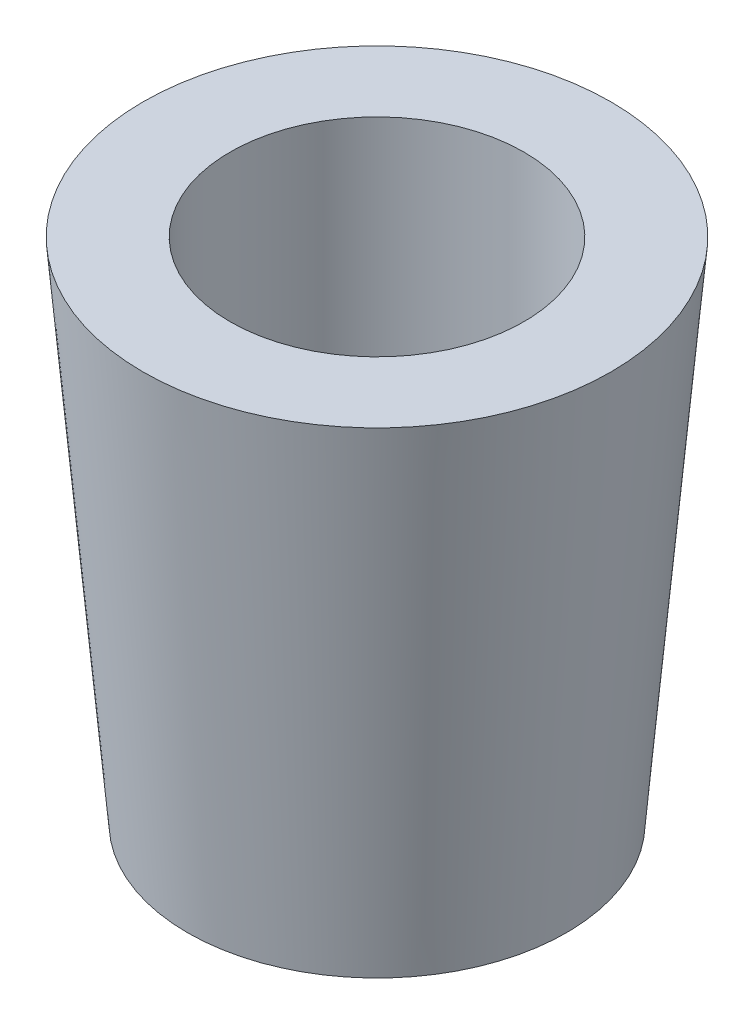
ISO-10303-21;
HEADER;
FILE_DESCRIPTION(('STEP AP214'),'2;1');
FILE_NAME('part.step','',(''),(''),'','','');
FILE_SCHEMA(('AUTOMOTIVE_DESIGN { 1 0 10303 214 1 1 1 1 }'));
ENDSEC;
DATA;
#1=APPLICATION_CONTEXT('core data for automotive mechanical design processes');
#2=APPLICATION_PROTOCOL_DEFINITION('international standard','automotive_design',2000,#1);
#3=PRODUCT_CONTEXT('',#1,'mechanical');
#4=PRODUCT('Part','Part','',(#3));
#5=PRODUCT_RELATED_PRODUCT_CATEGORY('part','',(#4));
#6=PRODUCT_DEFINITION_FORMATION('','',#4);
#7=PRODUCT_DEFINITION_CONTEXT('part definition',#1,'design');
#8=PRODUCT_DEFINITION('design','',#6,#7);
#9=PRODUCT_DEFINITION_SHAPE('','',#8);
#10=(LENGTH_UNIT() NAMED_UNIT(*) SI_UNIT(.MILLI.,.METRE.));
#11=(NAMED_UNIT(*) PLANE_ANGLE_UNIT() SI_UNIT($,.RADIAN.));
#12=(NAMED_UNIT(*) SI_UNIT($,.STERADIAN.) SOLID_ANGLE_UNIT());
#13=UNCERTAINTY_MEASURE_WITH_UNIT(LENGTH_MEASURE(1.E-05),#10,'distance_accuracy_value','');
#14=(GEOMETRIC_REPRESENTATION_CONTEXT(3) GLOBAL_UNCERTAINTY_ASSIGNED_CONTEXT((#13)) GLOBAL_UNIT_ASSIGNED_CONTEXT((#10,
#11,#12)) REPRESENTATION_CONTEXT('',''));
#15=CARTESIAN_POINT('',(0.,0.,0.));
#16=DIRECTION('',(0.,0.,1.));
#17=DIRECTION('',(1.,0.,0.));
#18=AXIS2_PLACEMENT_3D('',#15,#16,#17);
#19=CARTESIAN_POINT('',(0.,-25.4,0.));
#20=DIRECTION('',(0.,1.,0.));
#21=DIRECTION('',(0.,0.,1.));
#22=AXIS2_PLACEMENT_3D('',#19,#20,#21);
#23=CYLINDRICAL_SURFACE('',#22,3.175);
#24=CARTESIAN_POINT('',(0.,-25.4,0.));
#25=DIRECTION('',(0.,1.,0.));
#26=DIRECTION('',(0.,0.,1.));
#27=AXIS2_PLACEMENT_3D('',#24,#25,#26);
#28=CIRCLE('',#27,3.175);
#29=CARTESIAN_POINT('',(0.,-25.4,3.175));
#30=VERTEX_POINT('',#29);
#31=EDGE_CURVE('E43',#30,#30,#28,.T.);
#32=ORIENTED_EDGE('',*,*,#31,.F.);
#33=EDGE_LOOP('',(#32));
#34=FACE_BOUND('',#33,.T.);
#35=CARTESIAN_POINT('',(0.,-12.7,0.));
#36=DIRECTION('',(0.,1.,0.));
#37=DIRECTION('',(0.,0.,1.));
#38=AXIS2_PLACEMENT_3D('',#35,#36,#37);
#39=CIRCLE('',#38,3.175);
#40=CARTESIAN_POINT('',(0.,-12.7,3.175));
#41=VERTEX_POINT('',#40);
#42=EDGE_CURVE('E35',#41,#41,#39,.F.);
#43=ORIENTED_EDGE('',*,*,#42,.F.);
#44=EDGE_LOOP('',(#43));
#45=FACE_BOUND('',#44,.T.);
#46=ADVANCED_FACE('F31',(#34,#45),#23,.F.);
#47=CARTESIAN_POINT('',(0.,0.,0.));
#48=DIRECTION('',(0.,1.,0.));
#49=DIRECTION('',(0.,0.,1.));
#50=AXIS2_PLACEMENT_3D('',#47,#48,#49);
#51=CONICAL_SURFACE('',#50,11.7,0.0872664625997167);
#52=CARTESIAN_POINT('',(0.,-25.4,0.));
#53=DIRECTION('',(0.,1.,0.));
#54=DIRECTION('',(0.,0.,1.));
#55=AXIS2_PLACEMENT_3D('',#52,#53,#54);
#56=CIRCLE('',#55,9.47778794644153);
#57=CARTESIAN_POINT('',(0.,-25.4,9.47778794644153));
#58=VERTEX_POINT('',#57);
#59=EDGE_CURVE('E10',#58,#58,#56,.T.);
#60=ORIENTED_EDGE('',*,*,#59,.T.);
#61=EDGE_LOOP('',(#60));
#62=FACE_BOUND('',#61,.T.);
#63=CARTESIAN_POINT('',(0.,0.,0.));
#64=DIRECTION('',(0.,1.,0.));
#65=DIRECTION('',(0.,0.,1.));
#66=AXIS2_PLACEMENT_3D('',#63,#64,#65);
#67=CIRCLE('',#66,11.7);
#68=CARTESIAN_POINT('',(0.,0.,11.7));
#69=VERTEX_POINT('',#68);
#70=EDGE_CURVE('E39',#69,#69,#67,.T.);
#71=ORIENTED_EDGE('',*,*,#70,.F.);
#72=EDGE_LOOP('',(#71));
#73=FACE_BOUND('',#72,.T.);
#74=ADVANCED_FACE('F33',(#62,#73),#51,.T.);
#75=CARTESIAN_POINT('',(0.,-25.4,0.));
#76=DIRECTION('',(0.,1.,0.));
#77=DIRECTION('',(0.,0.,1.));
#78=AXIS2_PLACEMENT_3D('',#75,#76,#77);
#79=PLANE('',#78);
#80=CARTESIAN_POINT('',(5.82639397322076,-25.4,0.));
#81=DIRECTION('',(0.,-1.,0.));
#82=DIRECTION('',(0.,0.,-1.));
#83=AXIS2_PLACEMENT_3D('',#80,#81,#82);
#84=CIRCLE('',#83,1.75);
#85=CARTESIAN_POINT('',(5.82639397322076,-25.4,-1.75000000000004));
#86=VERTEX_POINT('',#85);
#87=EDGE_CURVE('E70',#86,#86,#84,.T.);
#88=ORIENTED_EDGE('',*,*,#87,.F.);
#89=EDGE_LOOP('',(#88));
#90=FACE_BOUND('',#89,.T.);
#91=CARTESIAN_POINT('',(0.,-25.4,-5.82639397322076));
#92=DIRECTION('',(0.,-1.,0.));
#93=DIRECTION('',(0.,0.,-1.));
#94=AXIS2_PLACEMENT_3D('',#91,#92,#93);
#95=CIRCLE('',#94,1.75);
#96=CARTESIAN_POINT('',(0.,-25.4,-7.57639397322076));
#97=VERTEX_POINT('',#96);
#98=EDGE_CURVE('E64',#97,#97,#95,.T.);
#99=ORIENTED_EDGE('',*,*,#98,.F.);
#100=EDGE_LOOP('',(#99));
#101=FACE_BOUND('',#100,.T.);
#102=CARTESIAN_POINT('',(-5.82639397322076,-25.4,0.));
#103=DIRECTION('',(0.,-1.,0.));
#104=DIRECTION('',(0.,0.,-1.));
#105=AXIS2_PLACEMENT_3D('',#102,#103,#104);
#106=CIRCLE('',#105,1.75);
#107=CARTESIAN_POINT('',(-5.82639397322076,-25.4,-1.75));
#108=VERTEX_POINT('',#107);
#109=EDGE_CURVE('E58',#108,#108,#106,.T.);
#110=ORIENTED_EDGE('',*,*,#109,.F.);
#111=EDGE_LOOP('',(#110));
#112=FACE_BOUND('',#111,.T.);
#113=CARTESIAN_POINT('',(0.,-25.4,5.82639397322076));
#114=DIRECTION('',(0.,-1.,0.));
#115=DIRECTION('',(0.,0.,-1.));
#116=AXIS2_PLACEMENT_3D('',#113,#114,#115);
#117=CIRCLE('',#116,1.75);
#118=CARTESIAN_POINT('',(0.,-25.4,4.07639397322076));
#119=VERTEX_POINT('',#118);
#120=EDGE_CURVE('E55',#119,#119,#117,.T.);
#121=ORIENTED_EDGE('',*,*,#120,.F.);
#122=EDGE_LOOP('',(#121));
#123=FACE_BOUND('',#122,.T.);
#124=ORIENTED_EDGE('',*,*,#31,.T.);
#125=EDGE_LOOP('',(#124));
#126=FACE_BOUND('',#125,.T.);
#127=ORIENTED_EDGE('',*,*,#59,.F.);
#128=EDGE_LOOP('',(#127));
#129=FACE_BOUND('',#128,.T.);
#130=ADVANCED_FACE('F81',(#90,#101,#112,#123,#126,#129),#79,.F.);
#131=CARTESIAN_POINT('',(0.,0.,0.));
#132=DIRECTION('',(0.,1.,0.));
#133=DIRECTION('',(0.,0.,1.));
#134=AXIS2_PLACEMENT_3D('',#131,#132,#133);
#135=PLANE('',#134);
#136=CARTESIAN_POINT('',(0.,0.,0.));
#137=DIRECTION('',(0.,1.,0.));
#138=DIRECTION('',(0.,0.,1.));
#139=AXIS2_PLACEMENT_3D('',#136,#137,#138);
#140=CIRCLE('',#139,7.35);
#141=CARTESIAN_POINT('',(0.,0.,7.35));
#142=VERTEX_POINT('',#141);
#143=EDGE_CURVE('E48',#142,#142,#140,.T.);
#144=ORIENTED_EDGE('',*,*,#143,.F.);
#145=EDGE_LOOP('',(#144));
#146=FACE_BOUND('',#145,.T.);
#147=ORIENTED_EDGE('',*,*,#70,.T.);
#148=EDGE_LOOP('',(#147));
#149=FACE_BOUND('',#148,.T.);
#150=ADVANCED_FACE('F84',(#146,#149),#135,.T.);
#151=CARTESIAN_POINT('',(0.,-12.7,0.));
#152=DIRECTION('',(0.,1.,0.));
#153=DIRECTION('',(0.,0.,1.));
#154=AXIS2_PLACEMENT_3D('',#151,#152,#153);
#155=PLANE('',#154);
#156=CARTESIAN_POINT('',(0.,-12.7,0.));
#157=DIRECTION('',(0.,1.,0.));
#158=DIRECTION('',(0.,0.,1.));
#159=AXIS2_PLACEMENT_3D('',#156,#157,#158);
#160=CIRCLE('',#159,7.35);
#161=CARTESIAN_POINT('',(0.,-12.7,7.35));
#162=VERTEX_POINT('',#161);
#163=EDGE_CURVE('E51',#162,#162,#160,.T.);
#164=ORIENTED_EDGE('',*,*,#163,.T.);
#165=EDGE_LOOP('',(#164));
#166=FACE_BOUND('',#165,.T.);
#167=ORIENTED_EDGE('',*,*,#42,.T.);
#168=EDGE_LOOP('',(#167));
#169=FACE_BOUND('',#168,.T.);
#170=ADVANCED_FACE('F101',(#166,#169),#155,.T.);
#171=CARTESIAN_POINT('',(0.,-12.7,0.));
#172=DIRECTION('',(0.,1.,0.));
#173=DIRECTION('',(0.,0.,1.));
#174=AXIS2_PLACEMENT_3D('',#171,#172,#173);
#175=CYLINDRICAL_SURFACE('',#174,7.35);
#176=ORIENTED_EDGE('',*,*,#163,.F.);
#177=EDGE_LOOP('',(#176));
#178=FACE_BOUND('',#177,.T.);
#179=ORIENTED_EDGE('',*,*,#143,.T.);
#180=EDGE_LOOP('',(#179));
#181=FACE_BOUND('',#180,.T.);
#182=ADVANCED_FACE('F103',(#178,#181),#175,.F.);
#183=CARTESIAN_POINT('',(0.,-17.78,5.82639397322076));
#184=DIRECTION('',(0.,-1.,0.));
#185=DIRECTION('',(0.,0.,-1.));
#186=AXIS2_PLACEMENT_3D('',#183,#184,#185);
#187=CYLINDRICAL_SURFACE('',#186,1.75);
#188=CARTESIAN_POINT('',(0.,-17.78,5.82639397322076));
#189=DIRECTION('',(0.,-1.,0.));
#190=DIRECTION('',(0.,0.,-1.));
#191=AXIS2_PLACEMENT_3D('',#188,#189,#190);
#192=CIRCLE('',#191,1.75);
#193=CARTESIAN_POINT('',(0.,-17.78,4.07639397322076));
#194=VERTEX_POINT('',#193);
#195=EDGE_CURVE('E52',#194,#194,#192,.T.);
#196=CARTESIAN_POINT('',(0.,-17.78,4.07639397322076));
#197=CARTESIAN_POINT('',(0.,-17.859375,4.07639397322076));
#198=CARTESIAN_POINT('',(0.,-17.93875,4.07639397322076));
#199=CARTESIAN_POINT('',(0.,-18.0975,4.07639397322076));
#200=CARTESIAN_POINT('',(0.,-18.176875,4.07639397322076));
#201=CARTESIAN_POINT('',(0.,-18.335625,4.07639397322076));
#202=CARTESIAN_POINT('',(0.,-18.415,4.07639397322076));
#203=CARTESIAN_POINT('',(0.,-18.57375,4.07639397322076));
#204=CARTESIAN_POINT('',(0.,-18.653125,4.07639397322076));
#205=CARTESIAN_POINT('',(0.,-18.811875,4.07639397322076));
#206=CARTESIAN_POINT('',(0.,-18.89125,4.07639397322076));
#207=CARTESIAN_POINT('',(0.,-19.05,4.07639397322076));
#208=CARTESIAN_POINT('',(0.,-19.129375,4.07639397322076));
#209=CARTESIAN_POINT('',(0.,-19.288125,4.07639397322076));
#210=CARTESIAN_POINT('',(0.,-19.3675,4.07639397322076));
#211=CARTESIAN_POINT('',(0.,-19.52625,4.07639397322076));
#212=CARTESIAN_POINT('',(0.,-19.605625,4.07639397322076));
#213=CARTESIAN_POINT('',(0.,-19.764375,4.07639397322076));
#214=CARTESIAN_POINT('',(0.,-19.84375,4.07639397322076));
#215=CARTESIAN_POINT('',(0.,-20.0025,4.07639397322076));
#216=CARTESIAN_POINT('',(0.,-20.081875,4.07639397322076));
#217=CARTESIAN_POINT('',(0.,-20.240625,4.07639397322076));
#218=CARTESIAN_POINT('',(0.,-20.32,4.07639397322076));
#219=CARTESIAN_POINT('',(0.,-20.47875,4.07639397322076));
#220=CARTESIAN_POINT('',(0.,-20.558125,4.07639397322076));
#221=CARTESIAN_POINT('',(0.,-20.716875,4.07639397322076));
#222=CARTESIAN_POINT('',(0.,-20.79625,4.07639397322076));
#223=CARTESIAN_POINT('',(0.,-20.955,4.07639397322076));
#224=CARTESIAN_POINT('',(0.,-21.034375,4.07639397322076));
#225=CARTESIAN_POINT('',(0.,-21.193125,4.07639397322076));
#226=CARTESIAN_POINT('',(0.,-21.2725,4.07639397322076));
#227=CARTESIAN_POINT('',(0.,-21.43125,4.07639397322076));
#228=CARTESIAN_POINT('',(0.,-21.510625,4.07639397322076));
#229=CARTESIAN_POINT('',(0.,-21.669375,4.07639397322076));
#230=CARTESIAN_POINT('',(0.,-21.74875,4.07639397322076));
#231=CARTESIAN_POINT('',(0.,-21.9075,4.07639397322076));
#232=CARTESIAN_POINT('',(0.,-21.986875,4.07639397322076));
#233=CARTESIAN_POINT('',(0.,-22.145625,4.07639397322076));
#234=CARTESIAN_POINT('',(0.,-22.225,4.07639397322076));
#235=CARTESIAN_POINT('',(0.,-22.38375,4.07639397322076));
#236=CARTESIAN_POINT('',(0.,-22.463125,4.07639397322076));
#237=CARTESIAN_POINT('',(0.,-22.621875,4.07639397322076));
#238=CARTESIAN_POINT('',(0.,-22.70125,4.07639397322076));
#239=CARTESIAN_POINT('',(0.,-22.86,4.07639397322076));
#240=CARTESIAN_POINT('',(0.,-22.939375,4.07639397322076));
#241=CARTESIAN_POINT('',(0.,-23.098125,4.07639397322076));
#242=CARTESIAN_POINT('',(0.,-23.1775,4.07639397322076));
#243=CARTESIAN_POINT('',(0.,-23.33625,4.07639397322076));
#244=CARTESIAN_POINT('',(0.,-23.415625,4.07639397322076));
#245=CARTESIAN_POINT('',(0.,-23.574375,4.07639397322076));
#246=CARTESIAN_POINT('',(0.,-23.65375,4.07639397322076));
#247=CARTESIAN_POINT('',(0.,-23.8125,4.07639397322076));
#248=CARTESIAN_POINT('',(0.,-23.891875,4.07639397322076));
#249=CARTESIAN_POINT('',(0.,-24.050625,4.07639397322076));
#250=CARTESIAN_POINT('',(0.,-24.13,4.07639397322076));
#251=CARTESIAN_POINT('',(0.,-24.28875,4.07639397322076));
#252=CARTESIAN_POINT('',(0.,-24.368125,4.07639397322076));
#253=CARTESIAN_POINT('',(0.,-24.526875,4.07639397322076));
#254=CARTESIAN_POINT('',(0.,-24.60625,4.07639397322076));
#255=CARTESIAN_POINT('',(0.,-24.765,4.07639397322076));
#256=CARTESIAN_POINT('',(0.,-24.844375,4.07639397322076));
#257=CARTESIAN_POINT('',(0.,-25.003125,4.07639397322076));
#258=CARTESIAN_POINT('',(0.,-25.0825,4.07639397322076));
#259=CARTESIAN_POINT('',(0.,-25.24125,4.07639397322076));
#260=CARTESIAN_POINT('',(0.,-25.320625,4.07639397322076));
#261=CARTESIAN_POINT('',(0.,-25.4,4.07639397322076));
#262=B_SPLINE_CURVE_WITH_KNOTS('',3,(#196,#197,#198,#199,#200,#201,#202,#203,#204,#205,#206,
#207,#208,#209,#210,#211,#212,#213,#214,#215,#216,#217,#218,#219,#220,#221,#222,#223,#224,#225,
#226,#227,#228,#229,#230,#231,#232,#233,#234,#235,#236,#237,#238,#239,#240,#241,#242,#243,#244,
#245,#246,#247,#248,#249,#250,#251,#252,#253,#254,#255,#256,#257,#258,#259,#260,#261),
.UNSPECIFIED.,.F.,.F.,(4,2,2,2,2,2,2,2,2,2,2,2,2,2,2,2,2,2,2,2,2,2,2,2,2,2,2,2,2,2,2,2,4),(0.,
0.238124999999999,0.476249999999998,0.714375,0.952499999999998,1.190625,1.42875,1.666875,1.905,
2.143125,2.38125,2.619375,2.8575,3.095625,3.33375,3.571875,3.81,4.048125,4.28624999999999,
4.524375,4.7625,5.000625,5.23875,5.476875,5.71499999999999,5.953125,6.19125,6.429375,6.6675,
6.905625,7.14374999999999,7.381875,7.61999999999999),.UNSPECIFIED.);
#263=EDGE_CURVE('BSEAM110',#194,#119,#262,.T.);
#264=ORIENTED_EDGE('',*,*,#195,.F.);
#265=ORIENTED_EDGE('',*,*,#120,.T.);
#266=ORIENTED_EDGE('',*,*,#263,.T.);
#267=ORIENTED_EDGE('',*,*,#263,.F.);
#268=EDGE_LOOP('',(#264,#266,#265,#267));
#269=FACE_BOUND('',#268,.T.);
#270=ADVANCED_FACE('F110',(#269),#187,.F.);
#271=CARTESIAN_POINT('',(0.,-17.78,5.82639397322076));
#272=DIRECTION('',(0.,-1.,0.));
#273=DIRECTION('',(0.,0.,-1.));
#274=AXIS2_PLACEMENT_3D('',#271,#272,#273);
#275=PLANE('',#274);
#276=ORIENTED_EDGE('',*,*,#195,.T.);
#277=EDGE_LOOP('',(#276));
#278=FACE_BOUND('',#277,.T.);
#279=ADVANCED_FACE('F117',(#278),#275,.T.);
#280=CARTESIAN_POINT('',(-5.82639397322076,-17.78,0.));
#281=DIRECTION('',(0.,-1.,0.));
#282=DIRECTION('',(0.,0.,-1.));
#283=AXIS2_PLACEMENT_3D('',#280,#281,#282);
#284=CYLINDRICAL_SURFACE('',#283,1.75);
#285=CARTESIAN_POINT('',(-5.82639397322076,-17.78,0.));
#286=DIRECTION('',(0.,-1.,0.));
#287=DIRECTION('',(0.,0.,-1.));
#288=AXIS2_PLACEMENT_3D('',#285,#286,#287);
#289=CIRCLE('',#288,1.75);
#290=CARTESIAN_POINT('',(-5.82639397322076,-17.78,-1.75));
#291=VERTEX_POINT('',#290);
#292=EDGE_CURVE('E61',#291,#291,#289,.T.);
#293=CARTESIAN_POINT('',(-5.82639397322076,-17.78,-1.75));
#294=CARTESIAN_POINT('',(-5.82639397322076,-17.859375,-1.75));
#295=CARTESIAN_POINT('',(-5.82639397322076,-17.93875,-1.75));
#296=CARTESIAN_POINT('',(-5.82639397322076,-18.0975,-1.75));
#297=CARTESIAN_POINT('',(-5.82639397322076,-18.176875,-1.75));
#298=CARTESIAN_POINT('',(-5.82639397322076,-18.335625,-1.75));
#299=CARTESIAN_POINT('',(-5.82639397322076,-18.415,-1.75));
#300=CARTESIAN_POINT('',(-5.82639397322076,-18.57375,-1.75));
#301=CARTESIAN_POINT('',(-5.82639397322076,-18.653125,-1.75));
#302=CARTESIAN_POINT('',(-5.82639397322076,-18.811875,-1.75));
#303=CARTESIAN_POINT('',(-5.82639397322076,-18.89125,-1.75));
#304=CARTESIAN_POINT('',(-5.82639397322076,-19.05,-1.75));
#305=CARTESIAN_POINT('',(-5.82639397322076,-19.129375,-1.75));
#306=CARTESIAN_POINT('',(-5.82639397322076,-19.288125,-1.75));
#307=CARTESIAN_POINT('',(-5.82639397322076,-19.3675,-1.75));
#308=CARTESIAN_POINT('',(-5.82639397322076,-19.52625,-1.75));
#309=CARTESIAN_POINT('',(-5.82639397322076,-19.605625,-1.75));
#310=CARTESIAN_POINT('',(-5.82639397322076,-19.764375,-1.75));
#311=CARTESIAN_POINT('',(-5.82639397322076,-19.84375,-1.75));
#312=CARTESIAN_POINT('',(-5.82639397322076,-20.0025,-1.75));
#313=CARTESIAN_POINT('',(-5.82639397322076,-20.081875,-1.75));
#314=CARTESIAN_POINT('',(-5.82639397322076,-20.240625,-1.75));
#315=CARTESIAN_POINT('',(-5.82639397322076,-20.32,-1.75));
#316=CARTESIAN_POINT('',(-5.82639397322076,-20.47875,-1.75));
#317=CARTESIAN_POINT('',(-5.82639397322076,-20.558125,-1.75));
#318=CARTESIAN_POINT('',(-5.82639397322076,-20.716875,-1.75));
#319=CARTESIAN_POINT('',(-5.82639397322076,-20.79625,-1.75));
#320=CARTESIAN_POINT('',(-5.82639397322076,-20.955,-1.75));
#321=CARTESIAN_POINT('',(-5.82639397322076,-21.034375,-1.75));
#322=CARTESIAN_POINT('',(-5.82639397322076,-21.193125,-1.75));
#323=CARTESIAN_POINT('',(-5.82639397322076,-21.2725,-1.75));
#324=CARTESIAN_POINT('',(-5.82639397322076,-21.43125,-1.75));
#325=CARTESIAN_POINT('',(-5.82639397322076,-21.510625,-1.75));
#326=CARTESIAN_POINT('',(-5.82639397322076,-21.669375,-1.75));
#327=CARTESIAN_POINT('',(-5.82639397322076,-21.74875,-1.75));
#328=CARTESIAN_POINT('',(-5.82639397322076,-21.9075,-1.75));
#329=CARTESIAN_POINT('',(-5.82639397322076,-21.986875,-1.75));
#330=CARTESIAN_POINT('',(-5.82639397322076,-22.145625,-1.75));
#331=CARTESIAN_POINT('',(-5.82639397322076,-22.225,-1.75));
#332=CARTESIAN_POINT('',(-5.82639397322076,-22.38375,-1.75));
#333=CARTESIAN_POINT('',(-5.82639397322076,-22.463125,-1.75));
#334=CARTESIAN_POINT('',(-5.82639397322076,-22.621875,-1.75));
#335=CARTESIAN_POINT('',(-5.82639397322076,-22.70125,-1.75));
#336=CARTESIAN_POINT('',(-5.82639397322076,-22.86,-1.75));
#337=CARTESIAN_POINT('',(-5.82639397322076,-22.939375,-1.75));
#338=CARTESIAN_POINT('',(-5.82639397322076,-23.098125,-1.75));
#339=CARTESIAN_POINT('',(-5.82639397322076,-23.1775,-1.75));
#340=CARTESIAN_POINT('',(-5.82639397322076,-23.33625,-1.75));
#341=CARTESIAN_POINT('',(-5.82639397322076,-23.415625,-1.75));
#342=CARTESIAN_POINT('',(-5.82639397322076,-23.574375,-1.75));
#343=CARTESIAN_POINT('',(-5.82639397322076,-23.65375,-1.75));
#344=CARTESIAN_POINT('',(-5.82639397322076,-23.8125,-1.75));
#345=CARTESIAN_POINT('',(-5.82639397322076,-23.891875,-1.75));
#346=CARTESIAN_POINT('',(-5.82639397322076,-24.050625,-1.75));
#347=CARTESIAN_POINT('',(-5.82639397322076,-24.13,-1.75));
#348=CARTESIAN_POINT('',(-5.82639397322076,-24.28875,-1.75));
#349=CARTESIAN_POINT('',(-5.82639397322076,-24.368125,-1.75));
#350=CARTESIAN_POINT('',(-5.82639397322076,-24.526875,-1.75));
#351=CARTESIAN_POINT('',(-5.82639397322076,-24.60625,-1.75));
#352=CARTESIAN_POINT('',(-5.82639397322076,-24.765,-1.75));
#353=CARTESIAN_POINT('',(-5.82639397322076,-24.844375,-1.75));
#354=CARTESIAN_POINT('',(-5.82639397322076,-25.003125,-1.75));
#355=CARTESIAN_POINT('',(-5.82639397322076,-25.0825,-1.75));
#356=CARTESIAN_POINT('',(-5.82639397322076,-25.24125,-1.75));
#357=CARTESIAN_POINT('',(-5.82639397322076,-25.320625,-1.75));
#358=CARTESIAN_POINT('',(-5.82639397322076,-25.4,-1.75));
#359=B_SPLINE_CURVE_WITH_KNOTS('',3,(#293,#294,#295,#296,#297,#298,#299,#300,#301,#302,#303,
#304,#305,#306,#307,#308,#309,#310,#311,#312,#313,#314,#315,#316,#317,#318,#319,#320,#321,#322,
#323,#324,#325,#326,#327,#328,#329,#330,#331,#332,#333,#334,#335,#336,#337,#338,#339,#340,#341,
#342,#343,#344,#345,#346,#347,#348,#349,#350,#351,#352,#353,#354,#355,#356,#357,#358),
.UNSPECIFIED.,.F.,.F.,(4,2,2,2,2,2,2,2,2,2,2,2,2,2,2,2,2,2,2,2,2,2,2,2,2,2,2,2,2,2,2,2,4),(0.,
0.238124999999999,0.476249999999998,0.714375,0.952499999999998,1.190625,1.42875,1.666875,1.905,
2.143125,2.38125,2.619375,2.8575,3.095625,3.33375,3.571875,3.81,4.048125,4.28624999999999,
4.524375,4.7625,5.000625,5.23875,5.476875,5.71499999999999,5.953125,6.19125,6.429375,6.6675,
6.905625,7.14374999999999,7.381875,7.61999999999999),.UNSPECIFIED.);
#360=EDGE_CURVE('BSEAM121',#291,#108,#359,.T.);
#361=ORIENTED_EDGE('',*,*,#292,.F.);
#362=ORIENTED_EDGE('',*,*,#109,.T.);
#363=ORIENTED_EDGE('',*,*,#360,.T.);
#364=ORIENTED_EDGE('',*,*,#360,.F.);
#365=EDGE_LOOP('',(#361,#363,#362,#364));
#366=FACE_BOUND('',#365,.T.);
#367=ADVANCED_FACE('F121',(#366),#284,.F.);
#368=CARTESIAN_POINT('',(-5.82639397322076,-17.78,0.));
#369=DIRECTION('',(0.,-1.,0.));
#370=DIRECTION('',(0.,0.,-1.));
#371=AXIS2_PLACEMENT_3D('',#368,#369,#370);
#372=PLANE('',#371);
#373=ORIENTED_EDGE('',*,*,#292,.T.);
#374=EDGE_LOOP('',(#373));
#375=FACE_BOUND('',#374,.T.);
#376=ADVANCED_FACE('F123',(#375),#372,.T.);
#377=CARTESIAN_POINT('',(0.,-17.78,-5.82639397322076));
#378=DIRECTION('',(0.,-1.,0.));
#379=DIRECTION('',(0.,0.,-1.));
#380=AXIS2_PLACEMENT_3D('',#377,#378,#379);
#381=CYLINDRICAL_SURFACE('',#380,1.75);
#382=CARTESIAN_POINT('',(0.,-17.78,-5.82639397322076));
#383=DIRECTION('',(0.,-1.,0.));
#384=DIRECTION('',(0.,0.,-1.));
#385=AXIS2_PLACEMENT_3D('',#382,#383,#384);
#386=CIRCLE('',#385,1.75);
#387=CARTESIAN_POINT('',(0.,-17.78,-7.57639397322076));
#388=VERTEX_POINT('',#387);
#389=EDGE_CURVE('E67',#388,#388,#386,.T.);
#390=CARTESIAN_POINT('',(0.,-17.78,-7.57639397322076));
#391=CARTESIAN_POINT('',(0.,-17.859375,-7.57639397322076));
#392=CARTESIAN_POINT('',(0.,-17.93875,-7.57639397322076));
#393=CARTESIAN_POINT('',(0.,-18.0975,-7.57639397322076));
#394=CARTESIAN_POINT('',(0.,-18.176875,-7.57639397322076));
#395=CARTESIAN_POINT('',(0.,-18.335625,-7.57639397322076));
#396=CARTESIAN_POINT('',(0.,-18.415,-7.57639397322076));
#397=CARTESIAN_POINT('',(0.,-18.57375,-7.57639397322076));
#398=CARTESIAN_POINT('',(0.,-18.653125,-7.57639397322076));
#399=CARTESIAN_POINT('',(0.,-18.811875,-7.57639397322076));
#400=CARTESIAN_POINT('',(0.,-18.89125,-7.57639397322076));
#401=CARTESIAN_POINT('',(0.,-19.05,-7.57639397322076));
#402=CARTESIAN_POINT('',(0.,-19.129375,-7.57639397322076));
#403=CARTESIAN_POINT('',(0.,-19.288125,-7.57639397322076));
#404=CARTESIAN_POINT('',(0.,-19.3675,-7.57639397322076));
#405=CARTESIAN_POINT('',(0.,-19.52625,-7.57639397322076));
#406=CARTESIAN_POINT('',(0.,-19.605625,-7.57639397322076));
#407=CARTESIAN_POINT('',(0.,-19.764375,-7.57639397322076));
#408=CARTESIAN_POINT('',(0.,-19.84375,-7.57639397322076));
#409=CARTESIAN_POINT('',(0.,-20.0025,-7.57639397322076));
#410=CARTESIAN_POINT('',(0.,-20.081875,-7.57639397322076));
#411=CARTESIAN_POINT('',(0.,-20.240625,-7.57639397322076));
#412=CARTESIAN_POINT('',(0.,-20.32,-7.57639397322076));
#413=CARTESIAN_POINT('',(0.,-20.47875,-7.57639397322076));
#414=CARTESIAN_POINT('',(0.,-20.558125,-7.57639397322076));
#415=CARTESIAN_POINT('',(0.,-20.716875,-7.57639397322076));
#416=CARTESIAN_POINT('',(0.,-20.79625,-7.57639397322076));
#417=CARTESIAN_POINT('',(0.,-20.955,-7.57639397322076));
#418=CARTESIAN_POINT('',(0.,-21.034375,-7.57639397322076));
#419=CARTESIAN_POINT('',(0.,-21.193125,-7.57639397322076));
#420=CARTESIAN_POINT('',(0.,-21.2725,-7.57639397322076));
#421=CARTESIAN_POINT('',(0.,-21.43125,-7.57639397322076));
#422=CARTESIAN_POINT('',(0.,-21.510625,-7.57639397322076));
#423=CARTESIAN_POINT('',(0.,-21.669375,-7.57639397322076));
#424=CARTESIAN_POINT('',(0.,-21.74875,-7.57639397322076));
#425=CARTESIAN_POINT('',(0.,-21.9075,-7.57639397322076));
#426=CARTESIAN_POINT('',(0.,-21.986875,-7.57639397322076));
#427=CARTESIAN_POINT('',(0.,-22.145625,-7.57639397322076));
#428=CARTESIAN_POINT('',(0.,-22.225,-7.57639397322076));
#429=CARTESIAN_POINT('',(0.,-22.38375,-7.57639397322076));
#430=CARTESIAN_POINT('',(0.,-22.463125,-7.57639397322076));
#431=CARTESIAN_POINT('',(0.,-22.621875,-7.57639397322076));
#432=CARTESIAN_POINT('',(0.,-22.70125,-7.57639397322076));
#433=CARTESIAN_POINT('',(0.,-22.86,-7.57639397322076));
#434=CARTESIAN_POINT('',(0.,-22.939375,-7.57639397322076));
#435=CARTESIAN_POINT('',(0.,-23.098125,-7.57639397322076));
#436=CARTESIAN_POINT('',(0.,-23.1775,-7.57639397322076));
#437=CARTESIAN_POINT('',(0.,-23.33625,-7.57639397322076));
#438=CARTESIAN_POINT('',(0.,-23.415625,-7.57639397322076));
#439=CARTESIAN_POINT('',(0.,-23.574375,-7.57639397322076));
#440=CARTESIAN_POINT('',(0.,-23.65375,-7.57639397322076));
#441=CARTESIAN_POINT('',(0.,-23.8125,-7.57639397322076));
#442=CARTESIAN_POINT('',(0.,-23.891875,-7.57639397322076));
#443=CARTESIAN_POINT('',(0.,-24.050625,-7.57639397322076));
#444=CARTESIAN_POINT('',(0.,-24.13,-7.57639397322076));
#445=CARTESIAN_POINT('',(0.,-24.28875,-7.57639397322076));
#446=CARTESIAN_POINT('',(0.,-24.368125,-7.57639397322076));
#447=CARTESIAN_POINT('',(0.,-24.526875,-7.57639397322076));
#448=CARTESIAN_POINT('',(0.,-24.60625,-7.57639397322076));
#449=CARTESIAN_POINT('',(0.,-24.765,-7.57639397322076));
#450=CARTESIAN_POINT('',(0.,-24.844375,-7.57639397322076));
#451=CARTESIAN_POINT('',(0.,-25.003125,-7.57639397322076));
#452=CARTESIAN_POINT('',(0.,-25.0825,-7.57639397322076));
#453=CARTESIAN_POINT('',(0.,-25.24125,-7.57639397322076));
#454=CARTESIAN_POINT('',(0.,-25.320625,-7.57639397322076));
#455=CARTESIAN_POINT('',(0.,-25.4,-7.57639397322076));
#456=B_SPLINE_CURVE_WITH_KNOTS('',3,(#390,#391,#392,#393,#394,#395,#396,#397,#398,#399,#400,
#401,#402,#403,#404,#405,#406,#407,#408,#409,#410,#411,#412,#413,#414,#415,#416,#417,#418,#419,
#420,#421,#422,#423,#424,#425,#426,#427,#428,#429,#430,#431,#432,#433,#434,#435,#436,#437,#438,
#439,#440,#441,#442,#443,#444,#445,#446,#447,#448,#449,#450,#451,#452,#453,#454,#455),
.UNSPECIFIED.,.F.,.F.,(4,2,2,2,2,2,2,2,2,2,2,2,2,2,2,2,2,2,2,2,2,2,2,2,2,2,2,2,2,2,2,2,4),(0.,
0.238124999999999,0.476249999999998,0.714375,0.952499999999998,1.190625,1.42875,1.666875,1.905,
2.143125,2.38125,2.619375,2.8575,3.095625,3.33375,3.571875,3.81,4.048125,4.28624999999999,
4.524375,4.7625,5.000625,5.23875,5.476875,5.71499999999999,5.953125,6.19125,6.429375,6.6675,
6.905625,7.14374999999999,7.381875,7.61999999999999),.UNSPECIFIED.);
#457=EDGE_CURVE('BSEAM126',#388,#97,#456,.T.);
#458=ORIENTED_EDGE('',*,*,#389,.F.);
#459=ORIENTED_EDGE('',*,*,#98,.T.);
#460=ORIENTED_EDGE('',*,*,#457,.T.);
#461=ORIENTED_EDGE('',*,*,#457,.F.);
#462=EDGE_LOOP('',(#458,#460,#459,#461));
#463=FACE_BOUND('',#462,.T.);
#464=ADVANCED_FACE('F126',(#463),#381,.F.);
#465=CARTESIAN_POINT('',(0.,-17.78,-5.82639397322076));
#466=DIRECTION('',(0.,-1.,0.));
#467=DIRECTION('',(0.,0.,-1.));
#468=AXIS2_PLACEMENT_3D('',#465,#466,#467);
#469=PLANE('',#468);
#470=ORIENTED_EDGE('',*,*,#389,.T.);
#471=EDGE_LOOP('',(#470));
#472=FACE_BOUND('',#471,.T.);
#473=ADVANCED_FACE('F131',(#472),#469,.T.);
#474=CARTESIAN_POINT('',(5.82639397322076,-17.78,0.));
#475=DIRECTION('',(0.,-1.,0.));
#476=DIRECTION('',(0.,0.,-1.));
#477=AXIS2_PLACEMENT_3D('',#474,#475,#476);
#478=CYLINDRICAL_SURFACE('',#477,1.75);
#479=CARTESIAN_POINT('',(5.82639397322076,-17.78,0.));
#480=DIRECTION('',(0.,-1.,0.));
#481=DIRECTION('',(0.,0.,-1.));
#482=AXIS2_PLACEMENT_3D('',#479,#480,#481);
#483=CIRCLE('',#482,1.75);
#484=CARTESIAN_POINT('',(5.82639397322076,-17.78,-1.75000000000004));
#485=VERTEX_POINT('',#484);
#486=EDGE_CURVE('E73',#485,#485,#483,.T.);
#487=CARTESIAN_POINT('',(5.82639397322076,-17.78,-1.75000000000004));
#488=CARTESIAN_POINT('',(5.82639397322076,-17.859375,-1.75000000000004));
#489=CARTESIAN_POINT('',(5.82639397322076,-17.93875,-1.75000000000004));
#490=CARTESIAN_POINT('',(5.82639397322076,-18.0975,-1.75000000000004));
#491=CARTESIAN_POINT('',(5.82639397322076,-18.176875,-1.75000000000004));
#492=CARTESIAN_POINT('',(5.82639397322076,-18.335625,-1.75000000000004));
#493=CARTESIAN_POINT('',(5.82639397322076,-18.415,-1.75000000000004));
#494=CARTESIAN_POINT('',(5.82639397322076,-18.57375,-1.75000000000004));
#495=CARTESIAN_POINT('',(5.82639397322076,-18.653125,-1.75000000000004));
#496=CARTESIAN_POINT('',(5.82639397322076,-18.811875,-1.75000000000004));
#497=CARTESIAN_POINT('',(5.82639397322076,-18.89125,-1.75000000000004));
#498=CARTESIAN_POINT('',(5.82639397322076,-19.05,-1.75000000000004));
#499=CARTESIAN_POINT('',(5.82639397322076,-19.129375,-1.75000000000004));
#500=CARTESIAN_POINT('',(5.82639397322076,-19.288125,-1.75000000000004));
#501=CARTESIAN_POINT('',(5.82639397322076,-19.3675,-1.75000000000004));
#502=CARTESIAN_POINT('',(5.82639397322076,-19.52625,-1.75000000000004));
#503=CARTESIAN_POINT('',(5.82639397322076,-19.605625,-1.75000000000004));
#504=CARTESIAN_POINT('',(5.82639397322076,-19.764375,-1.75000000000004));
#505=CARTESIAN_POINT('',(5.82639397322076,-19.84375,-1.75000000000004));
#506=CARTESIAN_POINT('',(5.82639397322076,-20.0025,-1.75000000000004));
#507=CARTESIAN_POINT('',(5.82639397322076,-20.081875,-1.75000000000004));
#508=CARTESIAN_POINT('',(5.82639397322076,-20.240625,-1.75000000000004));
#509=CARTESIAN_POINT('',(5.82639397322076,-20.32,-1.75000000000004));
#510=CARTESIAN_POINT('',(5.82639397322076,-20.47875,-1.75000000000004));
#511=CARTESIAN_POINT('',(5.82639397322076,-20.558125,-1.75000000000004));
#512=CARTESIAN_POINT('',(5.82639397322076,-20.716875,-1.75000000000004));
#513=CARTESIAN_POINT('',(5.82639397322076,-20.79625,-1.75000000000004));
#514=CARTESIAN_POINT('',(5.82639397322076,-20.955,-1.75000000000004));
#515=CARTESIAN_POINT('',(5.82639397322076,-21.034375,-1.75000000000004));
#516=CARTESIAN_POINT('',(5.82639397322076,-21.193125,-1.75000000000004));
#517=CARTESIAN_POINT('',(5.82639397322076,-21.2725,-1.75000000000004));
#518=CARTESIAN_POINT('',(5.82639397322076,-21.43125,-1.75000000000004));
#519=CARTESIAN_POINT('',(5.82639397322076,-21.510625,-1.75000000000004));
#520=CARTESIAN_POINT('',(5.82639397322076,-21.669375,-1.75000000000004));
#521=CARTESIAN_POINT('',(5.82639397322076,-21.74875,-1.75000000000004));
#522=CARTESIAN_POINT('',(5.82639397322076,-21.9075,-1.75000000000004));
#523=CARTESIAN_POINT('',(5.82639397322076,-21.986875,-1.75000000000004));
#524=CARTESIAN_POINT('',(5.82639397322076,-22.145625,-1.75000000000004));
#525=CARTESIAN_POINT('',(5.82639397322076,-22.225,-1.75000000000004));
#526=CARTESIAN_POINT('',(5.82639397322076,-22.38375,-1.75000000000004));
#527=CARTESIAN_POINT('',(5.82639397322076,-22.463125,-1.75000000000004));
#528=CARTESIAN_POINT('',(5.82639397322076,-22.621875,-1.75000000000004));
#529=CARTESIAN_POINT('',(5.82639397322076,-22.70125,-1.75000000000004));
#530=CARTESIAN_POINT('',(5.82639397322076,-22.86,-1.75000000000004));
#531=CARTESIAN_POINT('',(5.82639397322076,-22.939375,-1.75000000000004));
#532=CARTESIAN_POINT('',(5.82639397322076,-23.098125,-1.75000000000004));
#533=CARTESIAN_POINT('',(5.82639397322076,-23.1775,-1.75000000000004));
#534=CARTESIAN_POINT('',(5.82639397322076,-23.33625,-1.75000000000004));
#535=CARTESIAN_POINT('',(5.82639397322076,-23.415625,-1.75000000000004));
#536=CARTESIAN_POINT('',(5.82639397322076,-23.574375,-1.75000000000004));
#537=CARTESIAN_POINT('',(5.82639397322076,-23.65375,-1.75000000000004));
#538=CARTESIAN_POINT('',(5.82639397322076,-23.8125,-1.75000000000004));
#539=CARTESIAN_POINT('',(5.82639397322076,-23.891875,-1.75000000000004));
#540=CARTESIAN_POINT('',(5.82639397322076,-24.050625,-1.75000000000004));
#541=CARTESIAN_POINT('',(5.82639397322076,-24.13,-1.75000000000004));
#542=CARTESIAN_POINT('',(5.82639397322076,-24.28875,-1.75000000000004));
#543=CARTESIAN_POINT('',(5.82639397322076,-24.368125,-1.75000000000004));
#544=CARTESIAN_POINT('',(5.82639397322076,-24.526875,-1.75000000000004));
#545=CARTESIAN_POINT('',(5.82639397322076,-24.60625,-1.75000000000004));
#546=CARTESIAN_POINT('',(5.82639397322076,-24.765,-1.75000000000004));
#547=CARTESIAN_POINT('',(5.82639397322076,-24.844375,-1.75000000000004));
#548=CARTESIAN_POINT('',(5.82639397322076,-25.003125,-1.75000000000004));
#549=CARTESIAN_POINT('',(5.82639397322076,-25.0825,-1.75000000000004));
#550=CARTESIAN_POINT('',(5.82639397322076,-25.24125,-1.75000000000004));
#551=CARTESIAN_POINT('',(5.82639397322076,-25.320625,-1.75000000000004));
#552=CARTESIAN_POINT('',(5.82639397322076,-25.4,-1.75000000000004));
#553=B_SPLINE_CURVE_WITH_KNOTS('',3,(#487,#488,#489,#490,#491,#492,#493,#494,#495,#496,#497,
#498,#499,#500,#501,#502,#503,#504,#505,#506,#507,#508,#509,#510,#511,#512,#513,#514,#515,#516,
#517,#518,#519,#520,#521,#522,#523,#524,#525,#526,#527,#528,#529,#530,#531,#532,#533,#534,#535,
#536,#537,#538,#539,#540,#541,#542,#543,#544,#545,#546,#547,#548,#549,#550,#551,#552),
.UNSPECIFIED.,.F.,.F.,(4,2,2,2,2,2,2,2,2,2,2,2,2,2,2,2,2,2,2,2,2,2,2,2,2,2,2,2,2,2,2,2,4),(0.,
0.238124999999999,0.476249999999998,0.714375,0.952499999999998,1.190625,1.42875,1.666875,1.905,
2.143125,2.38125,2.619375,2.8575,3.095625,3.33375,3.571875,3.81,4.048125,4.28624999999999,
4.524375,4.7625,5.000625,5.23875,5.476875,5.71499999999999,5.953125,6.19125,6.429375,6.6675,
6.905625,7.14374999999999,7.381875,7.61999999999999),.UNSPECIFIED.);
#554=EDGE_CURVE('BSEAM79',#485,#86,#553,.T.);
#555=ORIENTED_EDGE('',*,*,#486,.F.);
#556=ORIENTED_EDGE('',*,*,#87,.T.);
#557=ORIENTED_EDGE('',*,*,#554,.T.);
#558=ORIENTED_EDGE('',*,*,#554,.F.);
#559=EDGE_LOOP('',(#555,#557,#556,#558));
#560=FACE_BOUND('',#559,.T.);
#561=ADVANCED_FACE('F79',(#560),#478,.F.);
#562=CARTESIAN_POINT('',(5.82639397322076,-17.78,0.));
#563=DIRECTION('',(0.,-1.,0.));
#564=DIRECTION('',(0.,0.,-1.));
#565=AXIS2_PLACEMENT_3D('',#562,#563,#564);
#566=PLANE('',#565);
#567=ORIENTED_EDGE('',*,*,#486,.T.);
#568=EDGE_LOOP('',(#567));
#569=FACE_BOUND('',#568,.T.);
#570=ADVANCED_FACE('F138',(#569),#566,.T.);
#571=CLOSED_SHELL('',(#46,#74,#130,#150,#170,#182,#270,#279,#367,#376,#464,#473,#561,#570));
#572=MANIFOLD_SOLID_BREP('B2',#571);
#573=ADVANCED_BREP_SHAPE_REPRESENTATION('',(#18,#572),#14);
#574=SHAPE_DEFINITION_REPRESENTATION(#9,#573);
ENDSEC;
END-ISO-10303-21;
